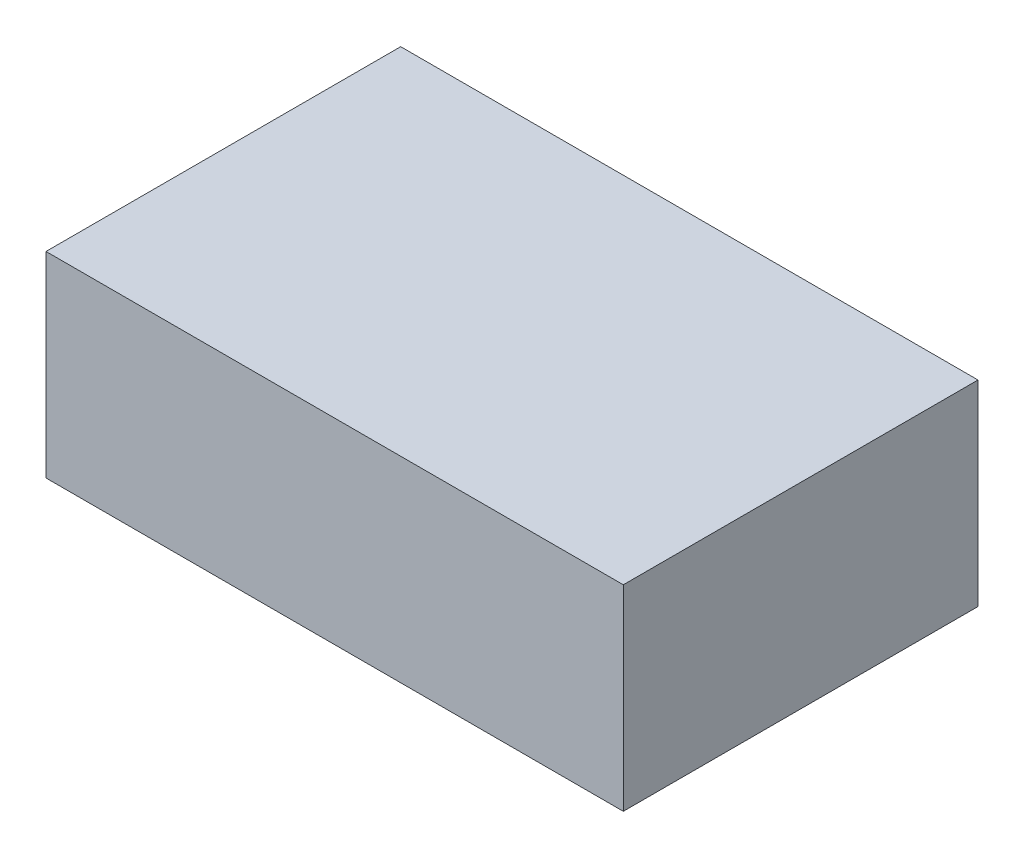
ISO-10303-21;
HEADER;
FILE_DESCRIPTION(('STEP AP214'),'2;1');
FILE_NAME('part.step','',(''),(''),'','','');
FILE_SCHEMA(('AUTOMOTIVE_DESIGN { 1 0 10303 214 1 1 1 1 }'));
ENDSEC;
DATA;
#1=APPLICATION_CONTEXT('core data for automotive mechanical design processes');
#2=APPLICATION_PROTOCOL_DEFINITION('international standard','automotive_design',2000,#1);
#3=PRODUCT_CONTEXT('',#1,'mechanical');
#4=PRODUCT('Part','Part','',(#3));
#5=PRODUCT_RELATED_PRODUCT_CATEGORY('part','',(#4));
#6=PRODUCT_DEFINITION_FORMATION('','',#4);
#7=PRODUCT_DEFINITION_CONTEXT('part definition',#1,'design');
#8=PRODUCT_DEFINITION('design','',#6,#7);
#9=PRODUCT_DEFINITION_SHAPE('','',#8);
#10=(LENGTH_UNIT() NAMED_UNIT(*) SI_UNIT(.MILLI.,.METRE.));
#11=(NAMED_UNIT(*) PLANE_ANGLE_UNIT() SI_UNIT($,.RADIAN.));
#12=(NAMED_UNIT(*) SI_UNIT($,.STERADIAN.) SOLID_ANGLE_UNIT());
#13=UNCERTAINTY_MEASURE_WITH_UNIT(LENGTH_MEASURE(1.E-05),#10,'distance_accuracy_value','');
#14=(GEOMETRIC_REPRESENTATION_CONTEXT(3) GLOBAL_UNCERTAINTY_ASSIGNED_CONTEXT((#13)) GLOBAL_UNIT_ASSIGNED_CONTEXT((#10,
#11,#12)) REPRESENTATION_CONTEXT('',''));
#15=CARTESIAN_POINT('',(0.,0.,0.));
#16=DIRECTION('',(0.,0.,1.));
#17=DIRECTION('',(1.,0.,0.));
#18=AXIS2_PLACEMENT_3D('',#15,#16,#17);
#19=CARTESIAN_POINT('',(-41.,576.,625.));
#20=DIRECTION('',(0.,1.,0.));
#21=DIRECTION('',(-1.,0.,0.));
#22=AXIS2_PLACEMENT_3D('',#19,#20,#21);
#23=PLANE('',#22);
#24=DIRECTION('',(1.,0.,0.));
#25=VECTOR('',#24,1.);
#26=CARTESIAN_POINT('',(-806.,576.,1095.));
#27=LINE('',#26,#25);
#28=CARTESIAN_POINT('',(-806.,576.,1095.));
#29=VERTEX_POINT('',#28);
#30=CARTESIAN_POINT('',(724.,576.,1095.));
#31=VERTEX_POINT('',#30);
#32=EDGE_CURVE('E83',#29,#31,#27,.T.);
#33=ORIENTED_EDGE('',*,*,#32,.F.);
#34=DIRECTION('',(0.,0.,1.));
#35=VECTOR('',#34,1.);
#36=CARTESIAN_POINT('',(-806.,576.,155.));
#37=LINE('',#36,#35);
#38=CARTESIAN_POINT('',(-806.,576.,155.));
#39=VERTEX_POINT('',#38);
#40=EDGE_CURVE('E35',#39,#29,#37,.T.);
#41=ORIENTED_EDGE('',*,*,#40,.F.);
#42=DIRECTION('',(-1.,0.,0.));
#43=VECTOR('',#42,1.);
#44=CARTESIAN_POINT('',(724.,576.,155.));
#45=LINE('',#44,#43);
#46=CARTESIAN_POINT('',(724.,576.,155.));
#47=VERTEX_POINT('',#46);
#48=EDGE_CURVE('E56',#47,#39,#45,.T.);
#49=ORIENTED_EDGE('',*,*,#48,.F.);
#50=DIRECTION('',(0.,0.,-1.));
#51=VECTOR('',#50,1.);
#52=CARTESIAN_POINT('',(724.,576.,1095.));
#53=LINE('',#52,#51);
#54=EDGE_CURVE('E27',#31,#47,#53,.T.);
#55=ORIENTED_EDGE('',*,*,#54,.F.);
#56=EDGE_LOOP('',(#33,#41,#49,#55));
#57=FACE_BOUND('',#56,.T.);
#58=ADVANCED_FACE('F17',(#57),#23,.F.);
#59=CARTESIAN_POINT('',(724.,576.,1095.));
#60=DIRECTION('',(1.,0.,0.));
#61=DIRECTION('',(0.,1.,0.));
#62=AXIS2_PLACEMENT_3D('',#59,#60,#61);
#63=PLANE('',#62);
#64=DIRECTION('',(0.,1.,0.));
#65=VECTOR('',#64,1.);
#66=CARTESIAN_POINT('',(724.,576.,155.));
#67=LINE('',#66,#65);
#68=CARTESIAN_POINT('',(724.,1096.,155.));
#69=VERTEX_POINT('',#68);
#70=EDGE_CURVE('E11',#47,#69,#67,.T.);
#71=ORIENTED_EDGE('',*,*,#70,.T.);
#72=DIRECTION('',(0.,0.,-1.));
#73=VECTOR('',#72,1.);
#74=CARTESIAN_POINT('',(724.,1096.,1095.));
#75=LINE('',#74,#73);
#76=CARTESIAN_POINT('',(724.,1096.,1095.));
#77=VERTEX_POINT('',#76);
#78=EDGE_CURVE('E21',#77,#69,#75,.T.);
#79=ORIENTED_EDGE('',*,*,#78,.F.);
#80=DIRECTION('',(0.,1.,0.));
#81=VECTOR('',#80,1.);
#82=CARTESIAN_POINT('',(724.,576.,1095.));
#83=LINE('',#82,#81);
#84=EDGE_CURVE('E69',#31,#77,#83,.T.);
#85=ORIENTED_EDGE('',*,*,#84,.F.);
#86=ORIENTED_EDGE('',*,*,#54,.T.);
#87=EDGE_LOOP('',(#71,#79,#85,#86));
#88=FACE_BOUND('',#87,.T.);
#89=ADVANCED_FACE('F66',(#88),#63,.T.);
#90=CARTESIAN_POINT('',(-806.,576.,1095.));
#91=DIRECTION('',(0.,0.,1.));
#92=DIRECTION('',(-1.,0.,0.));
#93=AXIS2_PLACEMENT_3D('',#90,#91,#92);
#94=PLANE('',#93);
#95=ORIENTED_EDGE('',*,*,#84,.T.);
#96=DIRECTION('',(1.,0.,0.));
#97=VECTOR('',#96,1.);
#98=CARTESIAN_POINT('',(-806.,1096.,1095.));
#99=LINE('',#98,#97);
#100=CARTESIAN_POINT('',(-806.,1096.,1095.));
#101=VERTEX_POINT('',#100);
#102=EDGE_CURVE('E78',#101,#77,#99,.T.);
#103=ORIENTED_EDGE('',*,*,#102,.F.);
#104=DIRECTION('',(0.,1.,0.));
#105=VECTOR('',#104,1.);
#106=CARTESIAN_POINT('',(-806.,576.,1095.));
#107=LINE('',#106,#105);
#108=EDGE_CURVE('E82',#29,#101,#107,.T.);
#109=ORIENTED_EDGE('',*,*,#108,.F.);
#110=ORIENTED_EDGE('',*,*,#32,.T.);
#111=EDGE_LOOP('',(#95,#103,#109,#110));
#112=FACE_BOUND('',#111,.T.);
#113=ADVANCED_FACE('F90',(#112),#94,.T.);
#114=CARTESIAN_POINT('',(-806.,576.,155.));
#115=DIRECTION('',(-1.,0.,0.));
#116=DIRECTION('',(0.,0.,1.));
#117=AXIS2_PLACEMENT_3D('',#114,#115,#116);
#118=PLANE('',#117);
#119=ORIENTED_EDGE('',*,*,#108,.T.);
#120=DIRECTION('',(0.,0.,1.));
#121=VECTOR('',#120,1.);
#122=CARTESIAN_POINT('',(-806.,1096.,155.));
#123=LINE('',#122,#121);
#124=CARTESIAN_POINT('',(-806.,1096.,155.));
#125=VERTEX_POINT('',#124);
#126=EDGE_CURVE('E76',#125,#101,#123,.T.);
#127=ORIENTED_EDGE('',*,*,#126,.F.);
#128=DIRECTION('',(0.,1.,0.));
#129=VECTOR('',#128,1.);
#130=CARTESIAN_POINT('',(-806.,576.,155.));
#131=LINE('',#130,#129);
#132=EDGE_CURVE('E62',#39,#125,#131,.T.);
#133=ORIENTED_EDGE('',*,*,#132,.F.);
#134=ORIENTED_EDGE('',*,*,#40,.T.);
#135=EDGE_LOOP('',(#119,#127,#133,#134));
#136=FACE_BOUND('',#135,.T.);
#137=ADVANCED_FACE('F91',(#136),#118,.T.);
#138=CARTESIAN_POINT('',(724.,576.,155.));
#139=DIRECTION('',(0.,0.,-1.));
#140=DIRECTION('',(0.,-1.,0.));
#141=AXIS2_PLACEMENT_3D('',#138,#139,#140);
#142=PLANE('',#141);
#143=ORIENTED_EDGE('',*,*,#132,.T.);
#144=DIRECTION('',(-1.,0.,0.));
#145=VECTOR('',#144,1.);
#146=CARTESIAN_POINT('',(724.,1096.,155.));
#147=LINE('',#146,#145);
#148=EDGE_CURVE('E63',#69,#125,#147,.T.);
#149=ORIENTED_EDGE('',*,*,#148,.F.);
#150=ORIENTED_EDGE('',*,*,#70,.F.);
#151=ORIENTED_EDGE('',*,*,#48,.T.);
#152=EDGE_LOOP('',(#143,#149,#150,#151));
#153=FACE_BOUND('',#152,.T.);
#154=ADVANCED_FACE('F71',(#153),#142,.T.);
#155=CARTESIAN_POINT('',(-41.,1096.,625.));
#156=DIRECTION('',(0.,1.,0.));
#157=DIRECTION('',(-1.,0.,0.));
#158=AXIS2_PLACEMENT_3D('',#155,#156,#157);
#159=PLANE('',#158);
#160=ORIENTED_EDGE('',*,*,#148,.T.);
#161=ORIENTED_EDGE('',*,*,#126,.T.);
#162=ORIENTED_EDGE('',*,*,#102,.T.);
#163=ORIENTED_EDGE('',*,*,#78,.T.);
#164=EDGE_LOOP('',(#160,#161,#162,#163));
#165=FACE_BOUND('',#164,.T.);
#166=ADVANCED_FACE('F19',(#165),#159,.T.);
#167=CLOSED_SHELL('',(#58,#89,#113,#137,#154,#166));
#168=MANIFOLD_SOLID_BREP('B1',#167);
#169=ADVANCED_BREP_SHAPE_REPRESENTATION('',(#18,#168),#14);
#170=SHAPE_DEFINITION_REPRESENTATION(#9,#169);
ENDSEC;
END-ISO-10303-21;
